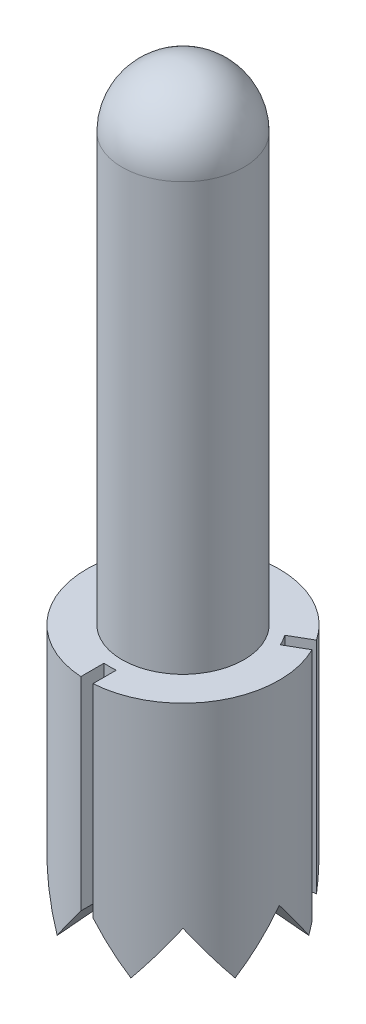
ISO-10303-21;
HEADER;
FILE_DESCRIPTION(('STEP AP214'),'2;1');
FILE_NAME('part.step','',(''),(''),'','','');
FILE_SCHEMA(('AUTOMOTIVE_DESIGN { 1 0 10303 214 1 1 1 1 }'));
ENDSEC;
DATA;
#1=APPLICATION_CONTEXT('core data for automotive mechanical design processes');
#2=APPLICATION_PROTOCOL_DEFINITION('international standard','automotive_design',2000,#1);
#3=PRODUCT_CONTEXT('',#1,'mechanical');
#4=PRODUCT('Part','Part','',(#3));
#5=PRODUCT_RELATED_PRODUCT_CATEGORY('part','',(#4));
#6=PRODUCT_DEFINITION_FORMATION('','',#4);
#7=PRODUCT_DEFINITION_CONTEXT('part definition',#1,'design');
#8=PRODUCT_DEFINITION('design','',#6,#7);
#9=PRODUCT_DEFINITION_SHAPE('','',#8);
#10=(LENGTH_UNIT() NAMED_UNIT(*) SI_UNIT(.MILLI.,.METRE.));
#11=(NAMED_UNIT(*) PLANE_ANGLE_UNIT() SI_UNIT($,.RADIAN.));
#12=(NAMED_UNIT(*) SI_UNIT($,.STERADIAN.) SOLID_ANGLE_UNIT());
#13=UNCERTAINTY_MEASURE_WITH_UNIT(LENGTH_MEASURE(1.E-05),#10,'distance_accuracy_value','');
#14=(GEOMETRIC_REPRESENTATION_CONTEXT(3) GLOBAL_UNCERTAINTY_ASSIGNED_CONTEXT((#13)) GLOBAL_UNIT_ASSIGNED_CONTEXT((#10,
#11,#12)) REPRESENTATION_CONTEXT('',''));
#15=CARTESIAN_POINT('',(0.,0.,0.));
#16=DIRECTION('',(0.,0.,1.));
#17=DIRECTION('',(1.,0.,0.));
#18=AXIS2_PLACEMENT_3D('',#15,#16,#17);
#19=CARTESIAN_POINT('',(-2.7302344744786,-2.95518450014505,2.7302344744786));
#20=DIRECTION('',(-0.561516668266343,-0.607781262065664,0.561516668266343));
#21=DIRECTION('',(0.734509555267757,-0.678598344545846,0.));
#22=AXIS2_PLACEMENT_3D('',#19,#20,#21);
#23=PLANE('',#22);
#24=DIRECTION('',(-0.826342975086386,0.447213595499958,-0.342282467452513));
#25=VECTOR('',#24,1.);
#26=CARTESIAN_POINT('',(3.69551813004515,-10.,1.53073372946036));
#27=LINE('',#26,#25);
#28=CARTESIAN_POINT('',(3.64932415341958,-9.975,1.5115995578421));
#29=VERTEX_POINT('',#28);
#30=CARTESIAN_POINT('',(0.,-8.,0.));
#31=VERTEX_POINT('',#30);
#32=EDGE_CURVE('E51',#29,#31,#27,.T.);
#33=ORIENTED_EDGE('',*,*,#32,.F.);
#34=CARTESIAN_POINT('',(0.,-8.,0.));
#35=DIRECTION('',(-0.561516668266343,-0.607781262065664,0.561516668266343));
#36=DIRECTION('',(-0.429766251884749,0.794104487760816,0.429766251884749));
#37=AXIS2_PLACEMENT_3D('',#34,#35,#36);
#38=ELLIPSE('',#37,6.49904866526347,3.95);
#39=CARTESIAN_POINT('',(2.79307178568686,-8.,2.79307178568687));
#40=VERTEX_POINT('',#39);
#41=EDGE_CURVE('E276',#29,#40,#38,.T.);
#42=ORIENTED_EDGE('',*,*,#41,.T.);
#43=DIRECTION('',(0.707106781186547,0.,0.707106781186548));
#44=VECTOR('',#43,1.);
#45=CARTESIAN_POINT('',(2.82842712474619,-8.,2.8284271247462));
#46=LINE('',#45,#44);
#47=EDGE_CURVE('E11',#31,#40,#46,.T.);
#48=ORIENTED_EDGE('',*,*,#47,.F.);
#49=EDGE_LOOP('',(#33,#42,#48));
#50=FACE_BOUND('',#49,.T.);
#51=ADVANCED_FACE('F41',(#50),#23,.T.);
#52=CARTESIAN_POINT('',(0.,-2.95518450014503,-3.86113462226621));
#53=DIRECTION('',(0.,-0.607781262065662,-0.794104487760818));
#54=DIRECTION('',(0.,0.794104487760818,-0.607781262065662));
#55=AXIS2_PLACEMENT_3D('',#52,#53,#54);
#56=PLANE('',#55);
#57=DIRECTION('',(-1.,0.,0.));
#58=VECTOR('',#57,1.);
#59=CARTESIAN_POINT('',(0.,-8.,0.));
#60=LINE('',#59,#58);
#61=CARTESIAN_POINT('',(3.95,-8.,0.));
#62=VERTEX_POINT('',#61);
#63=EDGE_CURVE('E199',#62,#31,#60,.T.);
#64=ORIENTED_EDGE('',*,*,#63,.F.);
#65=CARTESIAN_POINT('',(0.,-8.,0.));
#66=DIRECTION('',(0.,-0.607781262065662,-0.794104487760818));
#67=DIRECTION('',(0.,0.794104487760818,-0.607781262065662));
#68=AXIS2_PLACEMENT_3D('',#65,#66,#67);
#69=ELLIPSE('',#68,6.49904866526349,3.95);
#70=EDGE_CURVE('E269',#62,#29,#69,.T.);
#71=ORIENTED_EDGE('',*,*,#70,.T.);
#72=ORIENTED_EDGE('',*,*,#32,.T.);
#73=EDGE_LOOP('',(#64,#71,#72));
#74=FACE_BOUND('',#73,.T.);
#75=ADVANCED_FACE('F640',(#74),#56,.T.);
#76=CARTESIAN_POINT('',(-3.86113462226621,-2.95518450014505,0.));
#77=DIRECTION('',(-0.794104487760817,-0.607781262065664,0.));
#78=DIRECTION('',(0.607781262065664,-0.794104487760817,0.));
#79=AXIS2_PLACEMENT_3D('',#76,#77,#78);
#80=PLANE('',#79);
#81=DIRECTION('',(0.342282467452514,-0.447213595499957,0.826342975086386));
#82=VECTOR('',#81,1.);
#83=CARTESIAN_POINT('',(1.53073372946036,-10.,3.69551813004515));
#84=LINE('',#83,#82);
#85=CARTESIAN_POINT('',(1.51159955784211,-9.975,3.64932415341958));
#86=VERTEX_POINT('',#85);
#87=EDGE_CURVE('E200',#31,#86,#84,.T.);
#88=ORIENTED_EDGE('',*,*,#87,.T.);
#89=CARTESIAN_POINT('',(0.,-8.,0.));
#90=DIRECTION('',(-0.794104487760817,-0.607781262065664,0.));
#91=DIRECTION('',(-0.607781262065664,0.794104487760817,0.));
#92=AXIS2_PLACEMENT_3D('',#89,#90,#91);
#93=ELLIPSE('',#92,6.49904866526347,3.95);
#94=CARTESIAN_POINT('',(0.25,-8.32664074121909,3.94208066888541));
#95=VERTEX_POINT('',#94);
#96=EDGE_CURVE('E270',#86,#95,#93,.T.);
#97=ORIENTED_EDGE('',*,*,#96,.T.);
#98=DIRECTION('',(0.,0.,-1.));
#99=VECTOR('',#98,1.);
#100=CARTESIAN_POINT('',(0.250000000000001,-8.32664074121909,0.));
#101=LINE('',#100,#99);
#102=CARTESIAN_POINT('',(0.25,-8.32664074121909,2.98956518577535));
#103=VERTEX_POINT('',#102);
#104=EDGE_CURVE('E309',#95,#103,#101,.T.);
#105=ORIENTED_EDGE('',*,*,#104,.T.);
#106=CARTESIAN_POINT('',(0.,-8.,0.));
#107=DIRECTION('',(-0.794104487760817,-0.607781262065664,0.));
#108=DIRECTION('',(0.607781262065664,-0.794104487760817,0.));
#109=AXIS2_PLACEMENT_3D('',#106,#107,#108);
#110=ELLIPSE('',#109,4.93598632804821,3.);
#111=CARTESIAN_POINT('',(0.,-8.,3.));
#112=VERTEX_POINT('',#111);
#113=EDGE_CURVE('E231',#112,#103,#110,.F.);
#114=ORIENTED_EDGE('',*,*,#113,.F.);
#115=DIRECTION('',(0.,0.,1.));
#116=VECTOR('',#115,1.);
#117=CARTESIAN_POINT('',(0.,-8.,0.));
#118=LINE('',#117,#116);
#119=EDGE_CURVE('E205',#31,#112,#118,.T.);
#120=ORIENTED_EDGE('',*,*,#119,.F.);
#121=EDGE_LOOP('',(#88,#97,#105,#114,#120));
#122=FACE_BOUND('',#121,.T.);
#123=ADVANCED_FACE('F435',(#122),#80,.T.);
#124=CARTESIAN_POINT('',(2.73023447447859,-2.95518450014503,-2.73023447447859));
#125=DIRECTION('',(0.561516668266344,-0.607781262065662,-0.561516668266344));
#126=DIRECTION('',(0.734509555267755,0.678598344545848,0.));
#127=AXIS2_PLACEMENT_3D('',#124,#125,#126);
#128=PLANE('',#127);
#129=ORIENTED_EDGE('',*,*,#47,.T.);
#130=CARTESIAN_POINT('',(0.,-8.,0.));
#131=DIRECTION('',(0.561516668266344,-0.607781262065662,-0.561516668266344));
#132=DIRECTION('',(0.429766251884748,0.794104487760818,-0.429766251884747));
#133=AXIS2_PLACEMENT_3D('',#130,#131,#132);
#134=ELLIPSE('',#133,6.4990486652635,3.95);
#135=EDGE_CURVE('E273',#40,#86,#134,.T.);
#136=ORIENTED_EDGE('',*,*,#135,.T.);
#137=ORIENTED_EDGE('',*,*,#87,.F.);
#138=EDGE_LOOP('',(#129,#136,#137));
#139=FACE_BOUND('',#138,.T.);
#140=ADVANCED_FACE('F622',(#139),#128,.T.);
#141=CARTESIAN_POINT('',(3.86113462226621,-2.95518450014503,0.));
#142=DIRECTION('',(0.794104487760818,-0.607781262065662,0.));
#143=DIRECTION('',(0.607781262065662,0.794104487760818,0.));
#144=AXIS2_PLACEMENT_3D('',#141,#142,#143);
#145=PLANE('',#144);
#146=DIRECTION('',(0.,0.,1.));
#147=VECTOR('',#146,1.);
#148=CARTESIAN_POINT('',(-0.250000000000001,-8.3266407412191,0.));
#149=LINE('',#148,#147);
#150=CARTESIAN_POINT('',(-0.25,-8.32664074121909,2.98956518577535));
#151=VERTEX_POINT('',#150);
#152=CARTESIAN_POINT('',(-0.249999999999996,-8.32664074121909,3.94208066888541));
#153=VERTEX_POINT('',#152);
#154=EDGE_CURVE('E308',#151,#153,#149,.T.);
#155=ORIENTED_EDGE('',*,*,#154,.T.);
#156=CARTESIAN_POINT('',(0.,-8.,0.));
#157=DIRECTION('',(0.794104487760818,-0.607781262065662,0.));
#158=DIRECTION('',(0.607781262065662,0.794104487760818,0.));
#159=AXIS2_PLACEMENT_3D('',#156,#157,#158);
#160=ELLIPSE('',#159,6.49904866526349,3.95);
#161=CARTESIAN_POINT('',(-1.5115995578421,-9.975,3.64932415341959));
#162=VERTEX_POINT('',#161);
#163=EDGE_CURVE('E256',#153,#162,#160,.T.);
#164=ORIENTED_EDGE('',*,*,#163,.T.);
#165=DIRECTION('',(-0.342282467452514,-0.447213595499957,0.826342975086386));
#166=VECTOR('',#165,1.);
#167=CARTESIAN_POINT('',(-1.53073372946035,-10.,3.69551813004515));
#168=LINE('',#167,#166);
#169=EDGE_CURVE('E210',#31,#162,#168,.T.);
#170=ORIENTED_EDGE('',*,*,#169,.F.);
#171=ORIENTED_EDGE('',*,*,#119,.T.);
#172=CARTESIAN_POINT('',(0.,-8.,0.));
#173=DIRECTION('',(0.794104487760818,-0.607781262065662,0.));
#174=DIRECTION('',(-0.607781262065662,-0.794104487760818,0.));
#175=AXIS2_PLACEMENT_3D('',#172,#173,#174);
#176=ELLIPSE('',#175,4.93598632804822,3.);
#177=EDGE_CURVE('E234',#151,#112,#176,.F.);
#178=ORIENTED_EDGE('',*,*,#177,.F.);
#179=EDGE_LOOP('',(#155,#164,#170,#171,#178));
#180=FACE_BOUND('',#179,.T.);
#181=ADVANCED_FACE('F447',(#180),#145,.T.);
#182=CARTESIAN_POINT('',(-2.7302344744786,-2.95518450014504,-2.73023447447859));
#183=DIRECTION('',(-0.561516668266344,-0.607781262065663,-0.561516668266343));
#184=DIRECTION('',(0.734509555267756,-0.678598344545847,0.));
#185=AXIS2_PLACEMENT_3D('',#182,#183,#184);
#186=PLANE('',#185);
#187=ORIENTED_EDGE('',*,*,#169,.T.);
#188=CARTESIAN_POINT('',(0.,-8.,0.));
#189=DIRECTION('',(-0.561516668266344,-0.607781262065663,-0.561516668266343));
#190=DIRECTION('',(-0.429766251884749,0.794104487760817,-0.429766251884748));
#191=AXIS2_PLACEMENT_3D('',#188,#189,#190);
#192=ELLIPSE('',#191,6.49904866526348,3.95);
#193=CARTESIAN_POINT('',(-2.79307178568686,-8.,2.79307178568687));
#194=VERTEX_POINT('',#193);
#195=EDGE_CURVE('E251',#162,#194,#192,.T.);
#196=ORIENTED_EDGE('',*,*,#195,.T.);
#197=DIRECTION('',(-0.707106781186546,0.,0.707106781186549));
#198=VECTOR('',#197,1.);
#199=CARTESIAN_POINT('',(-2.82842712474619,-8.,2.8284271247462));
#200=LINE('',#199,#198);
#201=EDGE_CURVE('E212',#31,#194,#200,.T.);
#202=ORIENTED_EDGE('',*,*,#201,.F.);
#203=EDGE_LOOP('',(#187,#196,#202));
#204=FACE_BOUND('',#203,.T.);
#205=ADVANCED_FACE('F460',(#204),#186,.T.);
#206=CARTESIAN_POINT('',(-2.73023447447859,-2.95518450014503,-2.73023447447859));
#207=DIRECTION('',(-0.561516668266344,-0.607781262065662,-0.561516668266344));
#208=DIRECTION('',(0.,0.678598344545848,-0.734509555267755));
#209=AXIS2_PLACEMENT_3D('',#206,#207,#208);
#210=PLANE('',#209);
#211=DIRECTION('',(0.820387343691517,-0.320342746259435,-0.473650853720059));
#212=VECTOR('',#211,1.);
#213=CARTESIAN_POINT('',(-2.06035891672398,-7.46217738193782,1.47822390979265));
#214=LINE('',#213,#212);
#215=CARTESIAN_POINT('',(2.714039397151,-9.32647219263182,-1.27827624194156));
#216=VERTEX_POINT('',#215);
#217=CARTESIAN_POINT('',(3.53894200302231,-9.64857804688882,-1.75453398349659));
#218=VERTEX_POINT('',#217);
#219=EDGE_CURVE('E168',#216,#218,#214,.T.);
#220=ORIENTED_EDGE('',*,*,#219,.T.);
#221=CARTESIAN_POINT('',(0.,-8.,0.));
#222=DIRECTION('',(-0.561516668266344,-0.607781262065662,-0.561516668266344));
#223=DIRECTION('',(-0.429766251884748,0.794104487760818,-0.429766251884748));
#224=AXIS2_PLACEMENT_3D('',#221,#222,#223);
#225=ELLIPSE('',#224,6.49904866526349,3.95);
#226=CARTESIAN_POINT('',(3.64932415341958,-9.975,-1.51159955784211));
#227=VERTEX_POINT('',#226);
#228=EDGE_CURVE('E263',#218,#227,#225,.T.);
#229=ORIENTED_EDGE('',*,*,#228,.T.);
#230=DIRECTION('',(-0.826342975086386,0.447213595499958,0.342282467452514));
#231=VECTOR('',#230,1.);
#232=CARTESIAN_POINT('',(3.69551813004515,-10.,-1.53073372946036));
#233=LINE('',#232,#231);
#234=EDGE_CURVE('E204',#227,#31,#233,.T.);
#235=ORIENTED_EDGE('',*,*,#234,.T.);
#236=DIRECTION('',(-0.707106781186547,0.,0.707106781186548));
#237=VECTOR('',#236,1.);
#238=CARTESIAN_POINT('',(2.82842712474619,-8.,-2.82842712474619));
#239=LINE('',#238,#237);
#240=CARTESIAN_POINT('',(2.79307178568686,-8.,-2.79307178568687));
#241=VERTEX_POINT('',#240);
#242=EDGE_CURVE('E209',#241,#31,#239,.T.);
#243=ORIENTED_EDGE('',*,*,#242,.F.);
#244=CARTESIAN_POINT('',(0.,-8.,0.));
#245=DIRECTION('',(-0.561516668266344,-0.607781262065662,-0.561516668266344));
#246=DIRECTION('',(-0.429766251884748,0.794104487760818,-0.429766251884748));
#247=AXIS2_PLACEMENT_3D('',#244,#245,#246);
#248=ELLIPSE('',#247,6.49904866526349,3.95);
#249=CARTESIAN_POINT('',(3.28894200302231,-9.01755659116536,-2.18754668538881));
#250=VERTEX_POINT('',#249);
#251=EDGE_CURVE('E291',#241,#250,#248,.T.);
#252=ORIENTED_EDGE('',*,*,#251,.T.);
#253=DIRECTION('',(-0.820387343691517,0.320342746259435,0.473650853720059));
#254=VECTOR('',#253,1.);
#255=CARTESIAN_POINT('',(-2.14452323807,-6.89591101676558,0.949465934188309));
#256=LINE('',#255,#254);
#257=CARTESIAN_POINT('',(2.464039397151,-8.69545073690837,-1.71128894383378));
#258=VERTEX_POINT('',#257);
#259=EDGE_CURVE('E301',#250,#258,#256,.T.);
#260=ORIENTED_EDGE('',*,*,#259,.T.);
#261=CARTESIAN_POINT('',(0.,-8.,0.));
#262=DIRECTION('',(-0.561516668266344,-0.607781262065662,-0.561516668266344));
#263=DIRECTION('',(0.429766251884748,-0.794104487760818,0.429766251884748));
#264=AXIS2_PLACEMENT_3D('',#261,#262,#263);
#265=ELLIPSE('',#264,4.93598632804822,3.);
#266=EDGE_CURVE('E239',#216,#258,#265,.F.);
#267=ORIENTED_EDGE('',*,*,#266,.F.);
#268=EDGE_LOOP('',(#220,#229,#235,#243,#252,#260,#267));
#269=FACE_BOUND('',#268,.T.);
#270=ADVANCED_FACE('F442',(#269),#210,.T.);
#271=CARTESIAN_POINT('',(0.,-2.95518450014504,3.86113462226621));
#272=DIRECTION('',(0.,-0.607781262065663,0.794104487760817));
#273=DIRECTION('',(0.,-0.794104487760817,-0.607781262065663));
#274=AXIS2_PLACEMENT_3D('',#271,#272,#273);
#275=PLANE('',#274);
#276=ORIENTED_EDGE('',*,*,#234,.F.);
#277=CARTESIAN_POINT('',(0.,-8.,0.));
#278=DIRECTION('',(0.,-0.607781262065663,0.794104487760817));
#279=DIRECTION('',(0.,0.794104487760817,0.607781262065663));
#280=AXIS2_PLACEMENT_3D('',#277,#278,#279);
#281=ELLIPSE('',#280,6.49904866526348,3.95);
#282=EDGE_CURVE('E264',#227,#62,#281,.T.);
#283=ORIENTED_EDGE('',*,*,#282,.T.);
#284=ORIENTED_EDGE('',*,*,#63,.T.);
#285=EDGE_LOOP('',(#276,#283,#284));
#286=FACE_BOUND('',#285,.T.);
#287=ADVANCED_FACE('F588',(#286),#275,.T.);
#288=CARTESIAN_POINT('',(2.7302344744786,-2.95518450014505,2.7302344744786));
#289=DIRECTION('',(0.561516668266343,-0.607781262065664,0.561516668266343));
#290=DIRECTION('',(0.,-0.678598344545846,-0.734509555267757));
#291=AXIS2_PLACEMENT_3D('',#288,#289,#290);
#292=PLANE('',#291);
#293=DIRECTION('',(-0.342282467452512,0.447213595499958,0.826342975086386));
#294=VECTOR('',#293,1.);
#295=CARTESIAN_POINT('',(1.53073372946035,-10.,-3.69551813004515));
#296=LINE('',#295,#294);
#297=CARTESIAN_POINT('',(1.5115995578421,-9.975,-3.64932415341958));
#298=VERTEX_POINT('',#297);
#299=EDGE_CURVE('E215',#298,#31,#296,.T.);
#300=ORIENTED_EDGE('',*,*,#299,.F.);
#301=CARTESIAN_POINT('',(0.,-8.,0.));
#302=DIRECTION('',(0.561516668266343,-0.607781262065664,0.561516668266343));
#303=DIRECTION('',(0.429766251884749,0.794104487760817,0.429766251884749));
#304=AXIS2_PLACEMENT_3D('',#301,#302,#303);
#305=ELLIPSE('',#304,6.49904866526347,3.95);
#306=EDGE_CURVE('E286',#298,#241,#305,.T.);
#307=ORIENTED_EDGE('',*,*,#306,.T.);
#308=ORIENTED_EDGE('',*,*,#242,.T.);
#309=EDGE_LOOP('',(#300,#307,#308));
#310=FACE_BOUND('',#309,.T.);
#311=ADVANCED_FACE('F454',(#310),#292,.T.);
#312=CARTESIAN_POINT('',(-3.86113462226621,-2.95518450014502,0.));
#313=DIRECTION('',(-0.794104487760819,-0.607781262065661,0.));
#314=DIRECTION('',(0.607781262065661,-0.794104487760819,0.));
#315=AXIS2_PLACEMENT_3D('',#312,#313,#314);
#316=PLANE('',#315);
#317=DIRECTION('',(0.,0.,1.));
#318=VECTOR('',#317,1.);
#319=CARTESIAN_POINT('',(0.,-8.,0.));
#320=LINE('',#319,#318);
#321=CARTESIAN_POINT('',(0.,-8.,-3.95));
#322=VERTEX_POINT('',#321);
#323=EDGE_CURVE('E219',#322,#31,#320,.T.);
#324=ORIENTED_EDGE('',*,*,#323,.F.);
#325=CARTESIAN_POINT('',(0.,-8.,0.));
#326=DIRECTION('',(-0.794104487760819,-0.607781262065661,0.));
#327=DIRECTION('',(-0.607781262065661,0.794104487760819,0.));
#328=AXIS2_PLACEMENT_3D('',#325,#326,#327);
#329=ELLIPSE('',#328,6.4990486652635,3.95);
#330=EDGE_CURVE('E290',#322,#298,#329,.T.);
#331=ORIENTED_EDGE('',*,*,#330,.T.);
#332=ORIENTED_EDGE('',*,*,#299,.T.);
#333=EDGE_LOOP('',(#324,#331,#332));
#334=FACE_BOUND('',#333,.T.);
#335=ADVANCED_FACE('F465',(#334),#316,.T.);
#336=CARTESIAN_POINT('',(3.86113462226621,-2.95518450014504,0.));
#337=DIRECTION('',(0.794104487760817,-0.607781262065663,0.));
#338=DIRECTION('',(0.607781262065663,0.794104487760817,0.));
#339=AXIS2_PLACEMENT_3D('',#336,#337,#338);
#340=PLANE('',#339);
#341=DIRECTION('',(0.342282467452514,0.447213595499958,0.826342975086385));
#342=VECTOR('',#341,1.);
#343=CARTESIAN_POINT('',(-1.53073372946036,-10.,-3.69551813004515));
#344=LINE('',#343,#342);
#345=CARTESIAN_POINT('',(-1.51159955784211,-9.975,-3.64932415341958));
#346=VERTEX_POINT('',#345);
#347=EDGE_CURVE('E222',#346,#31,#344,.T.);
#348=ORIENTED_EDGE('',*,*,#347,.F.);
#349=CARTESIAN_POINT('',(0.,-8.,0.));
#350=DIRECTION('',(0.794104487760817,-0.607781262065663,0.));
#351=DIRECTION('',(0.607781262065663,0.794104487760817,0.));
#352=AXIS2_PLACEMENT_3D('',#349,#350,#351);
#353=ELLIPSE('',#352,6.49904866526348,3.95);
#354=EDGE_CURVE('E281',#346,#322,#353,.T.);
#355=ORIENTED_EDGE('',*,*,#354,.T.);
#356=ORIENTED_EDGE('',*,*,#323,.T.);
#357=EDGE_LOOP('',(#348,#355,#356));
#358=FACE_BOUND('',#357,.T.);
#359=ADVANCED_FACE('F374',(#358),#340,.T.);
#360=CARTESIAN_POINT('',(2.7302344744786,-2.95518450014506,-2.7302344744786));
#361=DIRECTION('',(0.561516668266343,-0.607781262065665,-0.561516668266343));
#362=DIRECTION('',(0.,0.678598344545845,-0.734509555267758));
#363=AXIS2_PLACEMENT_3D('',#360,#361,#362);
#364=PLANE('',#363);
#365=DIRECTION('',(-0.820387343691517,-0.320342746259432,-0.47365085372006));
#366=VECTOR('',#365,1.);
#367=CARTESIAN_POINT('',(2.14452323806998,-6.8959110167656,0.9494659341883));
#368=LINE('',#367,#366);
#369=CARTESIAN_POINT('',(-2.464039397151,-8.69545073690836,-1.71128894383379));
#370=VERTEX_POINT('',#369);
#371=CARTESIAN_POINT('',(-3.28894200302231,-9.01755659116535,-2.18754668538881));
#372=VERTEX_POINT('',#371);
#373=EDGE_CURVE('E297',#370,#372,#368,.T.);
#374=ORIENTED_EDGE('',*,*,#373,.T.);
#375=CARTESIAN_POINT('',(0.,-8.,0.));
#376=DIRECTION('',(0.561516668266343,-0.607781262065665,-0.561516668266343));
#377=DIRECTION('',(0.42976625188475,0.794104487760816,-0.42976625188475));
#378=AXIS2_PLACEMENT_3D('',#375,#376,#377);
#379=ELLIPSE('',#378,6.49904866526346,3.95);
#380=CARTESIAN_POINT('',(-2.79307178568686,-8.,-2.79307178568686));
#381=VERTEX_POINT('',#380);
#382=EDGE_CURVE('E277',#372,#381,#379,.T.);
#383=ORIENTED_EDGE('',*,*,#382,.T.);
#384=DIRECTION('',(0.707106781186548,0.,0.707106781186547));
#385=VECTOR('',#384,1.);
#386=CARTESIAN_POINT('',(-2.82842712474619,-8.,-2.82842712474619));
#387=LINE('',#386,#385);
#388=EDGE_CURVE('E230',#381,#31,#387,.T.);
#389=ORIENTED_EDGE('',*,*,#388,.T.);
#390=DIRECTION('',(-0.826342975086387,-0.447213595499957,-0.342282467452512));
#391=VECTOR('',#390,1.);
#392=CARTESIAN_POINT('',(-3.69551813004516,-10.,-1.53073372946035));
#393=LINE('',#392,#391);
#394=CARTESIAN_POINT('',(-3.64932415341959,-9.975,-1.5115995578421));
#395=VERTEX_POINT('',#394);
#396=EDGE_CURVE('E195',#31,#395,#393,.T.);
#397=ORIENTED_EDGE('',*,*,#396,.T.);
#398=CARTESIAN_POINT('',(0.,-8.,0.));
#399=DIRECTION('',(0.561516668266343,-0.607781262065665,-0.561516668266343));
#400=DIRECTION('',(0.42976625188475,0.794104487760816,-0.42976625188475));
#401=AXIS2_PLACEMENT_3D('',#398,#399,#400);
#402=ELLIPSE('',#401,6.49904866526346,3.95);
#403=CARTESIAN_POINT('',(-3.53894200302231,-9.6485780468888,-1.7545339834966));
#404=VERTEX_POINT('',#403);
#405=EDGE_CURVE('E243',#395,#404,#402,.T.);
#406=ORIENTED_EDGE('',*,*,#405,.T.);
#407=DIRECTION('',(0.820387343691517,0.320342746259432,0.47365085372006));
#408=VECTOR('',#407,1.);
#409=CARTESIAN_POINT('',(2.06035891672396,-7.46217738193784,1.47822390979264));
#410=LINE('',#409,#408);
#411=CARTESIAN_POINT('',(-2.714039397151,-9.32647219263181,-1.27827624194157));
#412=VERTEX_POINT('',#411);
#413=EDGE_CURVE('E299',#404,#412,#410,.T.);
#414=ORIENTED_EDGE('',*,*,#413,.T.);
#415=CARTESIAN_POINT('',(0.,-8.,0.));
#416=DIRECTION('',(0.561516668266343,-0.607781262065665,-0.561516668266343));
#417=DIRECTION('',(-0.42976625188475,-0.794104487760816,0.42976625188475));
#418=AXIS2_PLACEMENT_3D('',#415,#416,#417);
#419=ELLIPSE('',#418,4.9359863280482,3.);
#420=EDGE_CURVE('E238',#370,#412,#419,.F.);
#421=ORIENTED_EDGE('',*,*,#420,.F.);
#422=EDGE_LOOP('',(#374,#383,#389,#397,#406,#414,#421));
#423=FACE_BOUND('',#422,.T.);
#424=ADVANCED_FACE('F364',(#423),#364,.T.);
#425=CARTESIAN_POINT('',(-2.73023447447859,-2.95518450014503,2.73023447447859));
#426=DIRECTION('',(-0.561516668266344,-0.607781262065662,0.561516668266344));
#427=DIRECTION('',(0.,-0.678598344545848,-0.734509555267755));
#428=AXIS2_PLACEMENT_3D('',#425,#426,#427);
#429=PLANE('',#428);
#430=ORIENTED_EDGE('',*,*,#388,.F.);
#431=CARTESIAN_POINT('',(0.,-8.,0.));
#432=DIRECTION('',(-0.561516668266344,-0.607781262065662,0.561516668266344));
#433=DIRECTION('',(-0.429766251884747,0.794104487760818,0.429766251884748));
#434=AXIS2_PLACEMENT_3D('',#431,#432,#433);
#435=ELLIPSE('',#434,6.49904866526349,3.95);
#436=EDGE_CURVE('E282',#381,#346,#435,.T.);
#437=ORIENTED_EDGE('',*,*,#436,.T.);
#438=ORIENTED_EDGE('',*,*,#347,.T.);
#439=EDGE_LOOP('',(#430,#437,#438));
#440=FACE_BOUND('',#439,.T.);
#441=ADVANCED_FACE('F375',(#440),#429,.T.);
#442=CARTESIAN_POINT('',(0.,-2.95518450014502,3.8611346222662));
#443=DIRECTION('',(0.,-0.607781262065661,0.794104487760819));
#444=DIRECTION('',(0.,-0.794104487760819,-0.607781262065661));
#445=AXIS2_PLACEMENT_3D('',#442,#443,#444);
#446=PLANE('',#445);
#447=DIRECTION('',(-1.,0.,0.));
#448=VECTOR('',#447,1.);
#449=CARTESIAN_POINT('',(0.,-8.,0.));
#450=LINE('',#449,#448);
#451=CARTESIAN_POINT('',(-3.95,-8.,0.));
#452=VERTEX_POINT('',#451);
#453=EDGE_CURVE('E225',#31,#452,#450,.T.);
#454=ORIENTED_EDGE('',*,*,#453,.T.);
#455=CARTESIAN_POINT('',(0.,-8.,0.));
#456=DIRECTION('',(0.,-0.607781262065661,0.794104487760819));
#457=DIRECTION('',(0.,0.794104487760819,0.607781262065661));
#458=AXIS2_PLACEMENT_3D('',#455,#456,#457);
#459=ELLIPSE('',#458,6.4990486652635,3.95);
#460=EDGE_CURVE('E247',#452,#395,#459,.T.);
#461=ORIENTED_EDGE('',*,*,#460,.T.);
#462=ORIENTED_EDGE('',*,*,#396,.F.);
#463=EDGE_LOOP('',(#454,#461,#462));
#464=FACE_BOUND('',#463,.T.);
#465=ADVANCED_FACE('F377',(#464),#446,.T.);
#466=CARTESIAN_POINT('',(2.7302344744786,-2.95518450014503,2.73023447447859));
#467=DIRECTION('',(0.561516668266345,-0.607781262065661,0.561516668266344));
#468=DIRECTION('',(0.734509555267754,0.678598344545848,0.));
#469=AXIS2_PLACEMENT_3D('',#466,#467,#468);
#470=PLANE('',#469);
#471=ORIENTED_EDGE('',*,*,#201,.T.);
#472=CARTESIAN_POINT('',(0.,-8.,0.));
#473=DIRECTION('',(0.561516668266345,-0.607781262065661,0.561516668266344));
#474=DIRECTION('',(0.429766251884748,0.794104487760818,0.429766251884747));
#475=AXIS2_PLACEMENT_3D('',#472,#473,#474);
#476=ELLIPSE('',#475,6.4990486652635,3.95);
#477=CARTESIAN_POINT('',(-3.64932415341958,-9.975,1.51159955784211));
#478=VERTEX_POINT('',#477);
#479=EDGE_CURVE('E255',#194,#478,#476,.T.);
#480=ORIENTED_EDGE('',*,*,#479,.T.);
#481=DIRECTION('',(-0.826342975086385,-0.447213595499957,0.342282467452516));
#482=VECTOR('',#481,1.);
#483=CARTESIAN_POINT('',(-3.69551813004515,-10.,1.53073372946037));
#484=LINE('',#483,#482);
#485=EDGE_CURVE('E220',#31,#478,#484,.T.);
#486=ORIENTED_EDGE('',*,*,#485,.F.);
#487=EDGE_LOOP('',(#471,#480,#486));
#488=FACE_BOUND('',#487,.T.);
#489=ADVANCED_FACE('F388',(#488),#470,.T.);
#490=CARTESIAN_POINT('',(0.,-2.95518450014506,-3.86113462226622));
#491=DIRECTION('',(0.,-0.607781262065665,-0.794104487760816));
#492=DIRECTION('',(0.,0.794104487760816,-0.607781262065665));
#493=AXIS2_PLACEMENT_3D('',#490,#491,#492);
#494=PLANE('',#493);
#495=ORIENTED_EDGE('',*,*,#485,.T.);
#496=CARTESIAN_POINT('',(0.,-8.,0.));
#497=DIRECTION('',(0.,-0.607781262065665,-0.794104487760816));
#498=DIRECTION('',(0.,0.794104487760816,-0.607781262065665));
#499=AXIS2_PLACEMENT_3D('',#496,#497,#498);
#500=ELLIPSE('',#499,6.49904866526346,3.95);
#501=EDGE_CURVE('E249',#478,#452,#500,.T.);
#502=ORIENTED_EDGE('',*,*,#501,.T.);
#503=ORIENTED_EDGE('',*,*,#453,.F.);
#504=EDGE_LOOP('',(#495,#502,#503));
#505=FACE_BOUND('',#504,.T.);
#506=ADVANCED_FACE('F376',(#505),#494,.T.);
#507=CARTESIAN_POINT('',(0.,-10.,0.));
#508=DIRECTION('',(0.,1.,0.));
#509=DIRECTION('',(0.,0.,1.));
#510=AXIS2_PLACEMENT_3D('',#507,#508,#509);
#511=CYLINDRICAL_SURFACE('',#510,3.95);
#512=ORIENTED_EDGE('',*,*,#405,.F.);
#513=ORIENTED_EDGE('',*,*,#460,.F.);
#514=ORIENTED_EDGE('',*,*,#501,.F.);
#515=ORIENTED_EDGE('',*,*,#479,.F.);
#516=ORIENTED_EDGE('',*,*,#195,.F.);
#517=ORIENTED_EDGE('',*,*,#163,.F.);
#518=DIRECTION('',(0.,-1.,0.));
#519=VECTOR('',#518,1.);
#520=CARTESIAN_POINT('',(-0.249999999999996,0.,3.94208066888541));
#521=LINE('',#520,#519);
#522=CARTESIAN_POINT('',(-0.249999999999998,0.,3.94208066888541));
#523=VERTEX_POINT('',#522);
#524=EDGE_CURVE('E314',#523,#153,#521,.T.);
#525=ORIENTED_EDGE('',*,*,#524,.F.);
#526=CARTESIAN_POINT('',(0.,0.,0.));
#527=DIRECTION('',(0.,1.,0.));
#528=DIRECTION('',(0.,0.,1.));
#529=AXIS2_PLACEMENT_3D('',#526,#527,#528);
#530=CIRCLE('',#529,3.95);
#531=CARTESIAN_POINT('',(-3.53894200302231,0.,-1.75453398349659));
#532=VERTEX_POINT('',#531);
#533=EDGE_CURVE('E355',#523,#532,#530,.F.);
#534=ORIENTED_EDGE('',*,*,#533,.T.);
#535=DIRECTION('',(0.,-1.,0.));
#536=VECTOR('',#535,1.);
#537=CARTESIAN_POINT('',(-3.53894200302231,0.,-1.75453398349659));
#538=LINE('',#537,#536);
#539=EDGE_CURVE('E332',#532,#404,#538,.T.);
#540=ORIENTED_EDGE('',*,*,#539,.T.);
#541=EDGE_LOOP('',(#512,#513,#514,#515,#516,#517,#525,#534,#540));
#542=FACE_BOUND('',#541,.T.);
#543=ADVANCED_FACE('F380',(#542),#511,.T.);
#544=ORIENTED_EDGE('',*,*,#228,.F.);
#545=DIRECTION('',(0.,-1.,0.));
#546=VECTOR('',#545,1.);
#547=CARTESIAN_POINT('',(3.53894200302231,0.,-1.75453398349659));
#548=LINE('',#547,#546);
#549=CARTESIAN_POINT('',(3.53894200302231,0.,-1.75453398349659));
#550=VERTEX_POINT('',#549);
#551=EDGE_CURVE('E167',#550,#218,#548,.T.);
#552=ORIENTED_EDGE('',*,*,#551,.F.);
#553=CARTESIAN_POINT('',(0.,0.,0.));
#554=DIRECTION('',(0.,1.,0.));
#555=DIRECTION('',(0.,0.,1.));
#556=AXIS2_PLACEMENT_3D('',#553,#554,#555);
#557=CIRCLE('',#556,3.95);
#558=CARTESIAN_POINT('',(0.25,0.,3.94208066888541));
#559=VERTEX_POINT('',#558);
#560=EDGE_CURVE('E176',#550,#559,#557,.F.);
#561=ORIENTED_EDGE('',*,*,#560,.T.);
#562=DIRECTION('',(0.,-1.,0.));
#563=VECTOR('',#562,1.);
#564=CARTESIAN_POINT('',(0.25,0.,3.94208066888541));
#565=LINE('',#564,#563);
#566=EDGE_CURVE('E317',#559,#95,#565,.T.);
#567=ORIENTED_EDGE('',*,*,#566,.T.);
#568=ORIENTED_EDGE('',*,*,#96,.F.);
#569=ORIENTED_EDGE('',*,*,#135,.F.);
#570=ORIENTED_EDGE('',*,*,#41,.F.);
#571=ORIENTED_EDGE('',*,*,#70,.F.);
#572=ORIENTED_EDGE('',*,*,#282,.F.);
#573=EDGE_LOOP('',(#544,#552,#561,#567,#568,#569,#570,#571,#572));
#574=FACE_BOUND('',#573,.T.);
#575=ADVANCED_FACE('F379',(#574),#511,.T.);
#576=ORIENTED_EDGE('',*,*,#382,.F.);
#577=DIRECTION('',(0.,-1.,0.));
#578=VECTOR('',#577,1.);
#579=CARTESIAN_POINT('',(-3.28894200302231,0.,-2.18754668538881));
#580=LINE('',#579,#578);
#581=CARTESIAN_POINT('',(-3.28894200302231,0.,-2.18754668538881));
#582=VERTEX_POINT('',#581);
#583=EDGE_CURVE('E326',#582,#372,#580,.T.);
#584=ORIENTED_EDGE('',*,*,#583,.F.);
#585=CARTESIAN_POINT('',(0.,0.,0.));
#586=DIRECTION('',(0.,1.,0.));
#587=DIRECTION('',(0.,0.,1.));
#588=AXIS2_PLACEMENT_3D('',#585,#586,#587);
#589=CIRCLE('',#588,3.95);
#590=CARTESIAN_POINT('',(3.28894200302231,0.,-2.18754668538881));
#591=VERTEX_POINT('',#590);
#592=EDGE_CURVE('E316',#582,#591,#589,.F.);
#593=ORIENTED_EDGE('',*,*,#592,.T.);
#594=DIRECTION('',(0.,-1.,0.));
#595=VECTOR('',#594,1.);
#596=CARTESIAN_POINT('',(3.28894200302231,0.,-2.18754668538881));
#597=LINE('',#596,#595);
#598=EDGE_CURVE('E177',#591,#250,#597,.T.);
#599=ORIENTED_EDGE('',*,*,#598,.T.);
#600=ORIENTED_EDGE('',*,*,#251,.F.);
#601=ORIENTED_EDGE('',*,*,#306,.F.);
#602=ORIENTED_EDGE('',*,*,#330,.F.);
#603=ORIENTED_EDGE('',*,*,#354,.F.);
#604=ORIENTED_EDGE('',*,*,#436,.F.);
#605=EDGE_LOOP('',(#576,#584,#593,#599,#600,#601,#602,#603,#604));
#606=FACE_BOUND('',#605,.T.);
#607=ADVANCED_FACE('F385',(#606),#511,.T.);
#608=CARTESIAN_POINT('',(0.,0.,0.));
#609=DIRECTION('',(0.,-1.,0.));
#610=DIRECTION('',(0.,0.,-1.));
#611=AXIS2_PLACEMENT_3D('',#608,#609,#610);
#612=CYLINDRICAL_SURFACE('',#611,3.);
#613=DIRECTION('',(0.,-1.,0.));
#614=VECTOR('',#613,1.);
#615=CARTESIAN_POINT('',(-2.464039397151,0.,-1.71128894383379));
#616=LINE('',#615,#614);
#617=CARTESIAN_POINT('',(-2.464039397151,0.,-1.71128894383379));
#618=VERTEX_POINT('',#617);
#619=EDGE_CURVE('E157',#618,#370,#616,.T.);
#620=ORIENTED_EDGE('',*,*,#619,.T.);
#621=ORIENTED_EDGE('',*,*,#420,.T.);
#622=DIRECTION('',(0.,-1.,0.));
#623=VECTOR('',#622,1.);
#624=CARTESIAN_POINT('',(-2.714039397151,0.,-1.27827624194157));
#625=LINE('',#624,#623);
#626=CARTESIAN_POINT('',(-2.714039397151,0.,-1.27827624194157));
#627=VERTEX_POINT('',#626);
#628=EDGE_CURVE('E44',#627,#412,#625,.T.);
#629=ORIENTED_EDGE('',*,*,#628,.F.);
#630=CARTESIAN_POINT('',(0.,0.,0.));
#631=DIRECTION('',(0.,-1.,0.));
#632=DIRECTION('',(0.,0.,-1.));
#633=AXIS2_PLACEMENT_3D('',#630,#631,#632);
#634=CIRCLE('',#633,3.);
#635=EDGE_CURVE('E192',#627,#618,#634,.T.);
#636=ORIENTED_EDGE('',*,*,#635,.T.);
#637=EDGE_LOOP('',(#620,#621,#629,#636));
#638=FACE_BOUND('',#637,.T.);
#639=ADVANCED_FACE('F395',(#638),#612,.T.);
#640=CARTESIAN_POINT('',(0.125,0.,-0.216506350946109));
#641=DIRECTION('',(0.500000000000001,0.,-0.866025403784438));
#642=DIRECTION('',(-0.866025403784438,0.,-0.500000000000001));
#643=AXIS2_PLACEMENT_3D('',#640,#641,#642);
#644=PLANE('',#643);
#645=ORIENTED_EDGE('',*,*,#373,.F.);
#646=ORIENTED_EDGE('',*,*,#619,.F.);
#647=DIRECTION('',(0.866025403784438,0.,0.500000000000001));
#648=VECTOR('',#647,1.);
#649=CARTESIAN_POINT('',(0.125,0.,-0.216506350946109));
#650=LINE('',#649,#648);
#651=EDGE_CURVE('E336',#582,#618,#650,.T.);
#652=ORIENTED_EDGE('',*,*,#651,.F.);
#653=ORIENTED_EDGE('',*,*,#583,.T.);
#654=EDGE_LOOP('',(#645,#646,#652,#653));
#655=FACE_BOUND('',#654,.T.);
#656=ADVANCED_FACE('F43',(#655),#644,.F.);
#657=CARTESIAN_POINT('',(-0.125,0.,0.216506350946109));
#658=DIRECTION('',(-0.5,0.,0.866025403784438));
#659=DIRECTION('',(0.866025403784438,0.,0.5));
#660=AXIS2_PLACEMENT_3D('',#657,#658,#659);
#661=PLANE('',#660);
#662=ORIENTED_EDGE('',*,*,#413,.F.);
#663=ORIENTED_EDGE('',*,*,#539,.F.);
#664=DIRECTION('',(-0.866025403784439,0.,-0.5));
#665=VECTOR('',#664,1.);
#666=CARTESIAN_POINT('',(-0.125,0.,0.216506350946109));
#667=LINE('',#666,#665);
#668=EDGE_CURVE('E185',#627,#532,#667,.T.);
#669=ORIENTED_EDGE('',*,*,#668,.F.);
#670=ORIENTED_EDGE('',*,*,#628,.T.);
#671=EDGE_LOOP('',(#662,#663,#669,#670));
#672=FACE_BOUND('',#671,.T.);
#673=ADVANCED_FACE('F472',(#672),#661,.F.);
#674=CARTESIAN_POINT('',(0.,0.,0.));
#675=DIRECTION('',(0.,-1.,0.));
#676=DIRECTION('',(0.,0.,-1.));
#677=AXIS2_PLACEMENT_3D('',#674,#675,#676);
#678=CYLINDRICAL_SURFACE('',#677,3.);
#679=DIRECTION('',(0.,-1.,0.));
#680=VECTOR('',#679,1.);
#681=CARTESIAN_POINT('',(2.714039397151,0.,-1.27827624194156));
#682=LINE('',#681,#680);
#683=CARTESIAN_POINT('',(2.714039397151,0.,-1.27827624194156));
#684=VERTEX_POINT('',#683);
#685=EDGE_CURVE('E146',#684,#216,#682,.T.);
#686=ORIENTED_EDGE('',*,*,#685,.T.);
#687=ORIENTED_EDGE('',*,*,#266,.T.);
#688=DIRECTION('',(0.,-1.,0.));
#689=VECTOR('',#688,1.);
#690=CARTESIAN_POINT('',(2.464039397151,0.,-1.71128894383378));
#691=LINE('',#690,#689);
#692=CARTESIAN_POINT('',(2.464039397151,0.,-1.71128894383378));
#693=VERTEX_POINT('',#692);
#694=EDGE_CURVE('E155',#693,#258,#691,.T.);
#695=ORIENTED_EDGE('',*,*,#694,.F.);
#696=CARTESIAN_POINT('',(0.,0.,0.));
#697=DIRECTION('',(0.,-1.,0.));
#698=DIRECTION('',(0.,0.,-1.));
#699=AXIS2_PLACEMENT_3D('',#696,#697,#698);
#700=CIRCLE('',#699,3.);
#701=EDGE_CURVE('E143',#693,#684,#700,.T.);
#702=ORIENTED_EDGE('',*,*,#701,.T.);
#703=EDGE_LOOP('',(#686,#687,#695,#702));
#704=FACE_BOUND('',#703,.T.);
#705=ADVANCED_FACE('F147',(#704),#678,.T.);
#706=CARTESIAN_POINT('',(0.125,0.,0.216506350946109));
#707=DIRECTION('',(0.5,0.,0.866025403784439));
#708=DIRECTION('',(0.866025403784439,0.,-0.5));
#709=AXIS2_PLACEMENT_3D('',#706,#707,#708);
#710=PLANE('',#709);
#711=ORIENTED_EDGE('',*,*,#219,.F.);
#712=ORIENTED_EDGE('',*,*,#685,.F.);
#713=DIRECTION('',(-0.866025403784439,0.,0.5));
#714=VECTOR('',#713,1.);
#715=CARTESIAN_POINT('',(0.125,0.,0.216506350946109));
#716=LINE('',#715,#714);
#717=EDGE_CURVE('E163',#550,#684,#716,.T.);
#718=ORIENTED_EDGE('',*,*,#717,.F.);
#719=ORIENTED_EDGE('',*,*,#551,.T.);
#720=EDGE_LOOP('',(#711,#712,#718,#719));
#721=FACE_BOUND('',#720,.T.);
#722=ADVANCED_FACE('F162',(#721),#710,.F.);
#723=CARTESIAN_POINT('',(-0.125,0.,-0.216506350946109));
#724=DIRECTION('',(-0.5,0.,-0.866025403784439));
#725=DIRECTION('',(-0.866025403784439,0.,0.5));
#726=AXIS2_PLACEMENT_3D('',#723,#724,#725);
#727=PLANE('',#726);
#728=ORIENTED_EDGE('',*,*,#259,.F.);
#729=ORIENTED_EDGE('',*,*,#598,.F.);
#730=DIRECTION('',(0.866025403784439,0.,-0.5));
#731=VECTOR('',#730,1.);
#732=CARTESIAN_POINT('',(-0.125,0.,-0.216506350946109));
#733=LINE('',#732,#731);
#734=EDGE_CURVE('E160',#693,#591,#733,.T.);
#735=ORIENTED_EDGE('',*,*,#734,.F.);
#736=ORIENTED_EDGE('',*,*,#694,.T.);
#737=EDGE_LOOP('',(#728,#729,#735,#736));
#738=FACE_BOUND('',#737,.T.);
#739=ADVANCED_FACE('F485',(#738),#727,.F.);
#740=CARTESIAN_POINT('',(0.,0.,0.));
#741=DIRECTION('',(0.,-1.,0.));
#742=DIRECTION('',(0.,0.,-1.));
#743=AXIS2_PLACEMENT_3D('',#740,#741,#742);
#744=CYLINDRICAL_SURFACE('',#743,3.);
#745=DIRECTION('',(0.,-1.,0.));
#746=VECTOR('',#745,1.);
#747=CARTESIAN_POINT('',(-0.25,0.,2.98956518577535));
#748=LINE('',#747,#746);
#749=CARTESIAN_POINT('',(-0.25,0.,2.98956518577535));
#750=VERTEX_POINT('',#749);
#751=EDGE_CURVE('E315',#750,#151,#748,.T.);
#752=ORIENTED_EDGE('',*,*,#751,.T.);
#753=ORIENTED_EDGE('',*,*,#177,.T.);
#754=ORIENTED_EDGE('',*,*,#113,.T.);
#755=DIRECTION('',(0.,-1.,0.));
#756=VECTOR('',#755,1.);
#757=CARTESIAN_POINT('',(0.25,0.,2.98956518577535));
#758=LINE('',#757,#756);
#759=CARTESIAN_POINT('',(0.25,0.,2.98956518577535));
#760=VERTEX_POINT('',#759);
#761=EDGE_CURVE('E188',#760,#103,#758,.T.);
#762=ORIENTED_EDGE('',*,*,#761,.F.);
#763=CARTESIAN_POINT('',(0.,0.,0.));
#764=DIRECTION('',(0.,-1.,0.));
#765=DIRECTION('',(0.,0.,-1.));
#766=AXIS2_PLACEMENT_3D('',#763,#764,#765);
#767=CIRCLE('',#766,3.);
#768=EDGE_CURVE('E166',#760,#750,#767,.T.);
#769=ORIENTED_EDGE('',*,*,#768,.T.);
#770=EDGE_LOOP('',(#752,#753,#754,#762,#769));
#771=FACE_BOUND('',#770,.T.);
#772=ADVANCED_FACE('F439',(#771),#744,.T.);
#773=CARTESIAN_POINT('',(-0.250000000000001,0.,0.));
#774=DIRECTION('',(-1.,0.,0.));
#775=DIRECTION('',(0.,0.,1.));
#776=AXIS2_PLACEMENT_3D('',#773,#774,#775);
#777=PLANE('',#776);
#778=ORIENTED_EDGE('',*,*,#154,.F.);
#779=ORIENTED_EDGE('',*,*,#751,.F.);
#780=DIRECTION('',(0.,0.,-1.));
#781=VECTOR('',#780,1.);
#782=CARTESIAN_POINT('',(-0.250000000000001,0.,0.));
#783=LINE('',#782,#781);
#784=EDGE_CURVE('E184',#523,#750,#783,.T.);
#785=ORIENTED_EDGE('',*,*,#784,.F.);
#786=ORIENTED_EDGE('',*,*,#524,.T.);
#787=EDGE_LOOP('',(#778,#779,#785,#786));
#788=FACE_BOUND('',#787,.T.);
#789=ADVANCED_FACE('F473',(#788),#777,.F.);
#790=CARTESIAN_POINT('',(0.250000000000001,0.,0.));
#791=DIRECTION('',(1.,0.,0.));
#792=DIRECTION('',(0.,0.,-1.));
#793=AXIS2_PLACEMENT_3D('',#790,#791,#792);
#794=PLANE('',#793);
#795=ORIENTED_EDGE('',*,*,#104,.F.);
#796=ORIENTED_EDGE('',*,*,#566,.F.);
#797=DIRECTION('',(0.,0.,1.));
#798=VECTOR('',#797,1.);
#799=CARTESIAN_POINT('',(0.250000000000001,0.,0.));
#800=LINE('',#799,#798);
#801=EDGE_CURVE('E187',#760,#559,#800,.T.);
#802=ORIENTED_EDGE('',*,*,#801,.F.);
#803=ORIENTED_EDGE('',*,*,#761,.T.);
#804=EDGE_LOOP('',(#795,#796,#802,#803));
#805=FACE_BOUND('',#804,.T.);
#806=ADVANCED_FACE('F438',(#805),#794,.F.);
#807=CARTESIAN_POINT('',(0.,20.,0.));
#808=DIRECTION('',(0.,-1.,0.));
#809=DIRECTION('',(0.,0.,-1.));
#810=AXIS2_PLACEMENT_3D('',#807,#808,#809);
#811=CYLINDRICAL_SURFACE('',#810,2.5);
#812=CARTESIAN_POINT('',(0.,17.5,0.));
#813=DIRECTION('',(0.,-1.,0.));
#814=DIRECTION('',(0.,0.,-1.));
#815=AXIS2_PLACEMENT_3D('',#812,#813,#814);
#816=CIRCLE('',#815,2.5);
#817=CARTESIAN_POINT('',(0.,17.5,-2.5));
#818=VERTEX_POINT('',#817);
#819=EDGE_CURVE('E233',#818,#818,#816,.T.);
#820=ORIENTED_EDGE('',*,*,#819,.T.);
#821=EDGE_LOOP('',(#820));
#822=FACE_BOUND('',#821,.T.);
#823=CARTESIAN_POINT('',(0.,0.,0.));
#824=DIRECTION('',(0.,1.,0.));
#825=DIRECTION('',(0.,0.,1.));
#826=AXIS2_PLACEMENT_3D('',#823,#824,#825);
#827=CIRCLE('',#826,2.5);
#828=CARTESIAN_POINT('',(0.,0.,2.5));
#829=VERTEX_POINT('',#828);
#830=EDGE_CURVE('E346',#829,#829,#827,.T.);
#831=ORIENTED_EDGE('',*,*,#830,.T.);
#832=EDGE_LOOP('',(#831));
#833=FACE_BOUND('',#832,.T.);
#834=ADVANCED_FACE('F357',(#822,#833),#811,.T.);
#835=CARTESIAN_POINT('',(0.,0.,0.));
#836=DIRECTION('',(0.,-1.,0.));
#837=DIRECTION('',(0.,0.,-1.));
#838=AXIS2_PLACEMENT_3D('',#835,#836,#837);
#839=PLANE('',#838);
#840=ORIENTED_EDGE('',*,*,#533,.F.);
#841=ORIENTED_EDGE('',*,*,#784,.T.);
#842=ORIENTED_EDGE('',*,*,#768,.F.);
#843=ORIENTED_EDGE('',*,*,#801,.T.);
#844=ORIENTED_EDGE('',*,*,#560,.F.);
#845=ORIENTED_EDGE('',*,*,#717,.T.);
#846=ORIENTED_EDGE('',*,*,#701,.F.);
#847=ORIENTED_EDGE('',*,*,#734,.T.);
#848=ORIENTED_EDGE('',*,*,#592,.F.);
#849=ORIENTED_EDGE('',*,*,#651,.T.);
#850=ORIENTED_EDGE('',*,*,#635,.F.);
#851=ORIENTED_EDGE('',*,*,#668,.T.);
#852=EDGE_LOOP('',(#840,#841,#842,#843,#844,#845,#846,#847,#848,#849,#850,#851));
#853=FACE_BOUND('',#852,.T.);
#854=ORIENTED_EDGE('',*,*,#830,.F.);
#855=EDGE_LOOP('',(#854));
#856=FACE_BOUND('',#855,.T.);
#857=ADVANCED_FACE('F175',(#853,#856),#839,.F.);
#858=CARTESIAN_POINT('',(0.,17.5,0.));
#859=DIRECTION('',(0.,1.,0.));
#860=DIRECTION('',(0.,0.,1.));
#861=AXIS2_PLACEMENT_3D('',#858,#859,#860);
#862=SPHERICAL_SURFACE('',#861,2.5);
#863=ORIENTED_EDGE('',*,*,#819,.F.);
#864=EDGE_LOOP('',(#863));
#865=FACE_BOUND('',#864,.T.);
#866=ADVANCED_FACE('F365',(#865),#862,.T.);
#867=CLOSED_SHELL('',(#51,#75,#123,#140,#181,#205,#270,#287,#311,#335,#359,#424,#441,#465,#489,
#506,#543,#575,#607,#639,#656,#673,#705,#722,#739,#772,#789,#806,#834,#857,#866));
#868=MANIFOLD_SOLID_BREP('B2',#867);
#869=ADVANCED_BREP_SHAPE_REPRESENTATION('',(#18,#868),#14);
#870=SHAPE_DEFINITION_REPRESENTATION(#9,#869);
ENDSEC;
END-ISO-10303-21;
